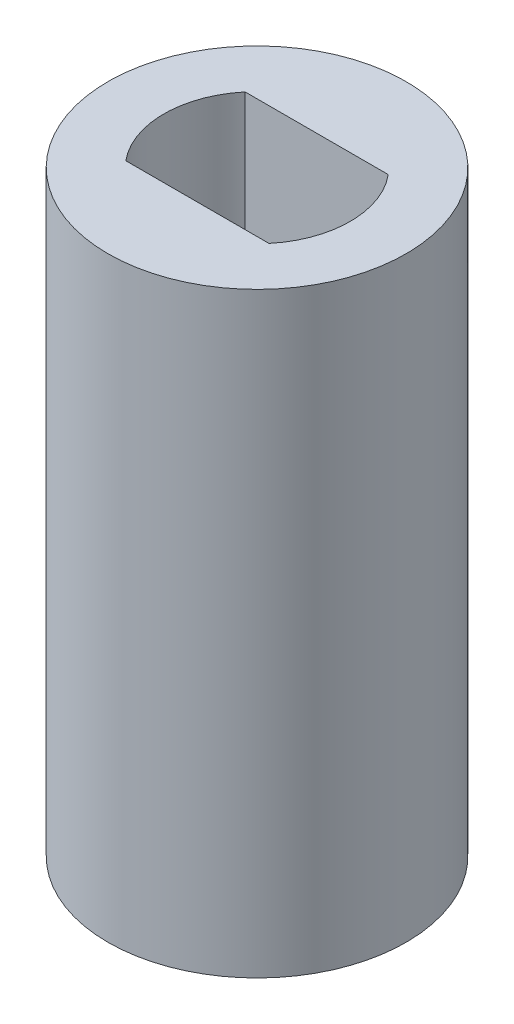
ISO-10303-21;
HEADER;
FILE_DESCRIPTION(('STEP AP214'),'2;1');
FILE_NAME('part.step','',(''),(''),'','','');
FILE_SCHEMA(('AUTOMOTIVE_DESIGN { 1 0 10303 214 1 1 1 1 }'));
ENDSEC;
DATA;
#1=APPLICATION_CONTEXT('core data for automotive mechanical design processes');
#2=APPLICATION_PROTOCOL_DEFINITION('international standard','automotive_design',2000,#1);
#3=PRODUCT_CONTEXT('',#1,'mechanical');
#4=PRODUCT('Part','Part','',(#3));
#5=PRODUCT_RELATED_PRODUCT_CATEGORY('part','',(#4));
#6=PRODUCT_DEFINITION_FORMATION('','',#4);
#7=PRODUCT_DEFINITION_CONTEXT('part definition',#1,'design');
#8=PRODUCT_DEFINITION('design','',#6,#7);
#9=PRODUCT_DEFINITION_SHAPE('','',#8);
#10=(LENGTH_UNIT() NAMED_UNIT(*) SI_UNIT(.MILLI.,.METRE.));
#11=(NAMED_UNIT(*) PLANE_ANGLE_UNIT() SI_UNIT($,.RADIAN.));
#12=(NAMED_UNIT(*) SI_UNIT($,.STERADIAN.) SOLID_ANGLE_UNIT());
#13=UNCERTAINTY_MEASURE_WITH_UNIT(LENGTH_MEASURE(1.E-05),#10,'distance_accuracy_value','');
#14=(GEOMETRIC_REPRESENTATION_CONTEXT(3) GLOBAL_UNCERTAINTY_ASSIGNED_CONTEXT((#13)) GLOBAL_UNIT_ASSIGNED_CONTEXT((#10,
#11,#12)) REPRESENTATION_CONTEXT('',''));
#15=CARTESIAN_POINT('',(0.,0.,0.));
#16=DIRECTION('',(0.,0.,1.));
#17=DIRECTION('',(1.,0.,0.));
#18=AXIS2_PLACEMENT_3D('',#15,#16,#17);
#19=CARTESIAN_POINT('',(0.,0.,0.));
#20=DIRECTION('',(0.,1.,0.));
#21=DIRECTION('',(0.,0.,1.));
#22=AXIS2_PLACEMENT_3D('',#19,#20,#21);
#23=PLANE('',#22);
#24=CARTESIAN_POINT('',(0.,0.,0.));
#25=DIRECTION('',(0.,1.,0.));
#26=DIRECTION('',(0.,0.,1.));
#27=AXIS2_PLACEMENT_3D('',#24,#25,#26);
#28=CIRCLE('',#27,4.);
#29=CARTESIAN_POINT('',(0.,0.,4.));
#30=VERTEX_POINT('',#29);
#31=EDGE_CURVE('E11',#30,#30,#28,.T.);
#32=ORIENTED_EDGE('',*,*,#31,.F.);
#33=EDGE_LOOP('',(#32));
#34=FACE_BOUND('',#33,.T.);
#35=CARTESIAN_POINT('',(0.,0.,0.));
#36=DIRECTION('',(0.,1.,0.));
#37=DIRECTION('',(0.,0.,1.));
#38=AXIS2_PLACEMENT_3D('',#35,#36,#37);
#39=CIRCLE('',#38,2.5);
#40=CARTESIAN_POINT('',(0.,0.,2.5));
#41=VERTEX_POINT('',#40);
#42=EDGE_CURVE('E130',#41,#41,#39,.T.);
#43=ORIENTED_EDGE('',*,*,#42,.T.);
#44=EDGE_LOOP('',(#43));
#45=FACE_BOUND('',#44,.T.);
#46=ADVANCED_FACE('F39',(#34,#45),#23,.F.);
#47=CARTESIAN_POINT('',(0.,11.,0.));
#48=DIRECTION('',(0.,-1.,0.));
#49=DIRECTION('',(0.,0.,-1.));
#50=AXIS2_PLACEMENT_3D('',#47,#48,#49);
#51=CYLINDRICAL_SURFACE('',#50,4.);
#52=ORIENTED_EDGE('',*,*,#31,.T.);
#53=EDGE_LOOP('',(#52));
#54=FACE_BOUND('',#53,.T.);
#55=CARTESIAN_POINT('',(0.,16.,0.));
#56=DIRECTION('',(0.,1.,0.));
#57=DIRECTION('',(0.,0.,1.));
#58=AXIS2_PLACEMENT_3D('',#55,#56,#57);
#59=CIRCLE('',#58,4.);
#60=CARTESIAN_POINT('',(0.,16.,4.));
#61=VERTEX_POINT('',#60);
#62=EDGE_CURVE('E102',#61,#61,#59,.T.);
#63=ORIENTED_EDGE('',*,*,#62,.F.);
#64=EDGE_LOOP('',(#63));
#65=FACE_BOUND('',#64,.T.);
#66=ADVANCED_FACE('F41',(#54,#65),#51,.T.);
#67=CARTESIAN_POINT('',(0.,11.,0.));
#68=DIRECTION('',(0.,-1.,0.));
#69=DIRECTION('',(0.,0.,-1.));
#70=AXIS2_PLACEMENT_3D('',#67,#68,#69);
#71=CYLINDRICAL_SURFACE('',#70,2.5);
#72=CARTESIAN_POINT('',(0.,11.,0.));
#73=DIRECTION('',(0.,1.,0.));
#74=DIRECTION('',(0.,0.,1.));
#75=AXIS2_PLACEMENT_3D('',#72,#73,#74);
#76=CIRCLE('',#75,2.5);
#77=CARTESIAN_POINT('',(-1.92093727122985,11.,1.6));
#78=VERTEX_POINT('',#77);
#79=CARTESIAN_POINT('',(1.92093727122985,11.,1.6));
#80=VERTEX_POINT('',#79);
#81=EDGE_CURVE('E131',#78,#80,#76,.T.);
#82=ORIENTED_EDGE('',*,*,#81,.T.);
#83=DIRECTION('',(0.,-1.,0.));
#84=VECTOR('',#83,1.);
#85=CARTESIAN_POINT('',(1.92093727122985,16.,1.6));
#86=LINE('',#85,#84);
#87=CARTESIAN_POINT('',(1.92093727122985,16.,1.6));
#88=VERTEX_POINT('',#87);
#89=EDGE_CURVE('E103',#88,#80,#86,.T.);
#90=ORIENTED_EDGE('',*,*,#89,.F.);
#91=CARTESIAN_POINT('',(0.,16.,0.));
#92=DIRECTION('',(0.,1.,0.));
#93=DIRECTION('',(0.,0.,1.));
#94=AXIS2_PLACEMENT_3D('',#91,#92,#93);
#95=CIRCLE('',#94,2.5);
#96=CARTESIAN_POINT('',(1.92093727122985,16.,-1.6));
#97=VERTEX_POINT('',#96);
#98=EDGE_CURVE('E107',#88,#97,#95,.T.);
#99=ORIENTED_EDGE('',*,*,#98,.T.);
#100=DIRECTION('',(0.,-1.,0.));
#101=VECTOR('',#100,1.);
#102=CARTESIAN_POINT('',(1.92093727122985,16.,-1.6));
#103=LINE('',#102,#101);
#104=CARTESIAN_POINT('',(1.92093727122985,11.,-1.6));
#105=VERTEX_POINT('',#104);
#106=EDGE_CURVE('E62',#97,#105,#103,.T.);
#107=ORIENTED_EDGE('',*,*,#106,.T.);
#108=CARTESIAN_POINT('',(-1.92093727122985,11.,-1.6));
#109=VERTEX_POINT('',#108);
#110=EDGE_CURVE('E48',#105,#109,#76,.T.);
#111=ORIENTED_EDGE('',*,*,#110,.T.);
#112=DIRECTION('',(0.,-1.,0.));
#113=VECTOR('',#112,1.);
#114=CARTESIAN_POINT('',(-1.92093727122985,16.,-1.6));
#115=LINE('',#114,#113);
#116=CARTESIAN_POINT('',(-1.92093727122985,16.,-1.6));
#117=VERTEX_POINT('',#116);
#118=EDGE_CURVE('E90',#117,#109,#115,.T.);
#119=ORIENTED_EDGE('',*,*,#118,.F.);
#120=CARTESIAN_POINT('',(0.,16.,0.));
#121=DIRECTION('',(0.,1.,0.));
#122=DIRECTION('',(0.,0.,1.));
#123=AXIS2_PLACEMENT_3D('',#120,#121,#122);
#124=CIRCLE('',#123,2.5);
#125=CARTESIAN_POINT('',(-1.92093727122985,16.,1.6));
#126=VERTEX_POINT('',#125);
#127=EDGE_CURVE('E83',#117,#126,#124,.T.);
#128=ORIENTED_EDGE('',*,*,#127,.T.);
#129=DIRECTION('',(0.,-1.,0.));
#130=VECTOR('',#129,1.);
#131=CARTESIAN_POINT('',(-1.92093727122985,16.,1.6));
#132=LINE('',#131,#130);
#133=EDGE_CURVE('E88',#126,#78,#132,.T.);
#134=ORIENTED_EDGE('',*,*,#133,.T.);
#135=EDGE_LOOP('',(#82,#90,#99,#107,#111,#119,#128,#134));
#136=FACE_BOUND('',#135,.T.);
#137=ORIENTED_EDGE('',*,*,#42,.F.);
#138=EDGE_LOOP('',(#137));
#139=FACE_BOUND('',#138,.T.);
#140=ADVANCED_FACE('F86',(#136,#139),#71,.F.);
#141=CARTESIAN_POINT('',(0.,11.,0.));
#142=DIRECTION('',(0.,1.,0.));
#143=DIRECTION('',(0.,0.,1.));
#144=AXIS2_PLACEMENT_3D('',#141,#142,#143);
#145=PLANE('',#144);
#146=ORIENTED_EDGE('',*,*,#110,.F.);
#147=DIRECTION('',(-1.,0.,0.));
#148=VECTOR('',#147,1.);
#149=CARTESIAN_POINT('',(1.92093727122985,11.,-1.6));
#150=LINE('',#149,#148);
#151=EDGE_CURVE('E96',#105,#109,#150,.T.);
#152=ORIENTED_EDGE('',*,*,#151,.T.);
#153=EDGE_LOOP('',(#146,#152));
#154=FACE_BOUND('',#153,.T.);
#155=ADVANCED_FACE('F138',(#154),#145,.F.);
#156=CARTESIAN_POINT('',(0.,16.,0.));
#157=DIRECTION('',(0.,1.,0.));
#158=DIRECTION('',(0.,0.,1.));
#159=AXIS2_PLACEMENT_3D('',#156,#157,#158);
#160=PLANE('',#159);
#161=ORIENTED_EDGE('',*,*,#62,.T.);
#162=EDGE_LOOP('',(#161));
#163=FACE_BOUND('',#162,.T.);
#164=DIRECTION('',(1.,0.,0.));
#165=VECTOR('',#164,1.);
#166=CARTESIAN_POINT('',(1.92093727122985,16.,1.6));
#167=LINE('',#166,#165);
#168=EDGE_CURVE('E95',#126,#88,#167,.T.);
#169=ORIENTED_EDGE('',*,*,#168,.F.);
#170=ORIENTED_EDGE('',*,*,#127,.F.);
#171=DIRECTION('',(-1.,0.,0.));
#172=VECTOR('',#171,1.);
#173=CARTESIAN_POINT('',(1.92093727122985,16.,-1.6));
#174=LINE('',#173,#172);
#175=EDGE_CURVE('E111',#97,#117,#174,.T.);
#176=ORIENTED_EDGE('',*,*,#175,.F.);
#177=ORIENTED_EDGE('',*,*,#98,.F.);
#178=EDGE_LOOP('',(#169,#170,#176,#177));
#179=FACE_BOUND('',#178,.T.);
#180=ADVANCED_FACE('F106',(#163,#179),#160,.T.);
#181=ORIENTED_EDGE('',*,*,#81,.F.);
#182=DIRECTION('',(1.,0.,0.));
#183=VECTOR('',#182,1.);
#184=CARTESIAN_POINT('',(1.92093727122985,11.,1.6));
#185=LINE('',#184,#183);
#186=EDGE_CURVE('E54',#78,#80,#185,.T.);
#187=ORIENTED_EDGE('',*,*,#186,.T.);
#188=EDGE_LOOP('',(#181,#187));
#189=FACE_BOUND('',#188,.T.);
#190=ADVANCED_FACE('F146',(#189),#145,.F.);
#191=CARTESIAN_POINT('',(1.92093727122985,16.,1.6));
#192=DIRECTION('',(0.,0.,-1.));
#193=DIRECTION('',(-1.,0.,0.));
#194=AXIS2_PLACEMENT_3D('',#191,#192,#193);
#195=PLANE('',#194);
#196=ORIENTED_EDGE('',*,*,#186,.F.);
#197=ORIENTED_EDGE('',*,*,#133,.F.);
#198=ORIENTED_EDGE('',*,*,#168,.T.);
#199=ORIENTED_EDGE('',*,*,#89,.T.);
#200=EDGE_LOOP('',(#196,#197,#198,#199));
#201=FACE_BOUND('',#200,.T.);
#202=ADVANCED_FACE('F99',(#201),#195,.T.);
#203=CARTESIAN_POINT('',(1.92093727122985,16.,-1.6));
#204=DIRECTION('',(0.,0.,1.));
#205=DIRECTION('',(1.,0.,0.));
#206=AXIS2_PLACEMENT_3D('',#203,#204,#205);
#207=PLANE('',#206);
#208=ORIENTED_EDGE('',*,*,#151,.F.);
#209=ORIENTED_EDGE('',*,*,#106,.F.);
#210=ORIENTED_EDGE('',*,*,#175,.T.);
#211=ORIENTED_EDGE('',*,*,#118,.T.);
#212=EDGE_LOOP('',(#208,#209,#210,#211));
#213=FACE_BOUND('',#212,.T.);
#214=ADVANCED_FACE('F164',(#213),#207,.T.);
#215=CLOSED_SHELL('',(#46,#66,#140,#155,#180,#190,#202,#214));
#216=MANIFOLD_SOLID_BREP('B2',#215);
#217=ADVANCED_BREP_SHAPE_REPRESENTATION('',(#18,#216),#14);
#218=SHAPE_DEFINITION_REPRESENTATION(#9,#217);
ENDSEC;
END-ISO-10303-21;
